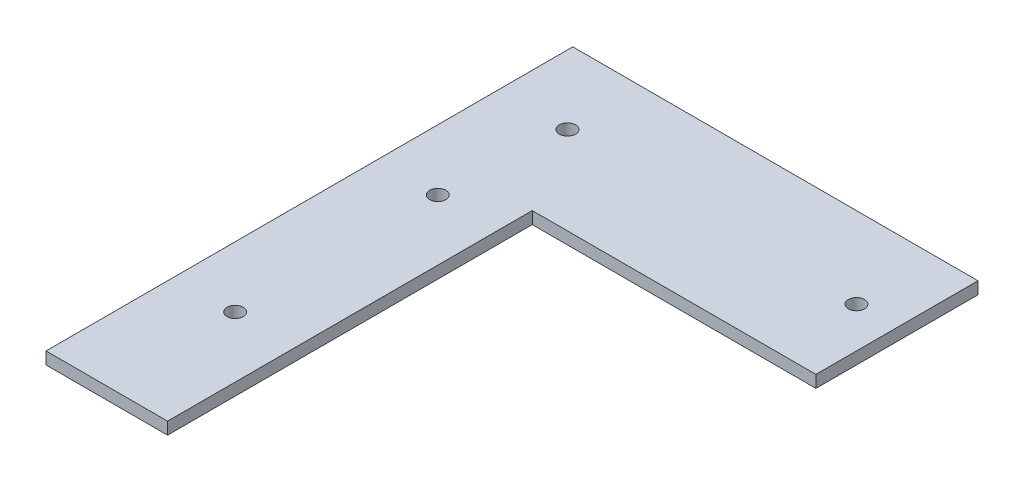
ISO-10303-21;
HEADER;
FILE_DESCRIPTION(('STEP AP214'),'2;1');
FILE_NAME('part.step','',(''),(''),'','','');
FILE_SCHEMA(('AUTOMOTIVE_DESIGN { 1 0 10303 214 1 1 1 1 }'));
ENDSEC;
DATA;
#1=APPLICATION_CONTEXT('core data for automotive mechanical design processes');
#2=APPLICATION_PROTOCOL_DEFINITION('international standard','automotive_design',2000,#1);
#3=PRODUCT_CONTEXT('',#1,'mechanical');
#4=PRODUCT('Part','Part','',(#3));
#5=PRODUCT_RELATED_PRODUCT_CATEGORY('part','',(#4));
#6=PRODUCT_DEFINITION_FORMATION('','',#4);
#7=PRODUCT_DEFINITION_CONTEXT('part definition',#1,'design');
#8=PRODUCT_DEFINITION('design','',#6,#7);
#9=PRODUCT_DEFINITION_SHAPE('','',#8);
#10=(LENGTH_UNIT() NAMED_UNIT(*) SI_UNIT(.MILLI.,.METRE.));
#11=(NAMED_UNIT(*) PLANE_ANGLE_UNIT() SI_UNIT($,.RADIAN.));
#12=(NAMED_UNIT(*) SI_UNIT($,.STERADIAN.) SOLID_ANGLE_UNIT());
#13=UNCERTAINTY_MEASURE_WITH_UNIT(LENGTH_MEASURE(1.E-05),#10,'distance_accuracy_value','');
#14=(GEOMETRIC_REPRESENTATION_CONTEXT(3) GLOBAL_UNCERTAINTY_ASSIGNED_CONTEXT((#13)) GLOBAL_UNIT_ASSIGNED_CONTEXT((#10,
#11,#12)) REPRESENTATION_CONTEXT('',''));
#15=CARTESIAN_POINT('',(0.,0.,0.));
#16=DIRECTION('',(0.,0.,1.));
#17=DIRECTION('',(1.,0.,0.));
#18=AXIS2_PLACEMENT_3D('',#15,#16,#17);
#19=CARTESIAN_POINT('',(-22.4355300859599,3.,-53.323782234957));
#20=DIRECTION('',(-1.,0.,0.));
#21=DIRECTION('',(0.,0.,1.));
#22=AXIS2_PLACEMENT_3D('',#19,#20,#21);
#23=PLANE('',#22);
#24=DIRECTION('',(0.,0.,-1.));
#25=VECTOR('',#24,1.);
#26=CARTESIAN_POINT('',(-22.4355300859599,0.,-53.323782234957));
#27=LINE('',#26,#25);
#28=CARTESIAN_POINT('',(-22.4355300859599,0.,36.676217765043));
#29=VERTEX_POINT('',#28);
#30=CARTESIAN_POINT('',(-22.4355300859599,0.,-53.323782234957));
#31=VERTEX_POINT('',#30);
#32=EDGE_CURVE('E117',#29,#31,#27,.T.);
#33=ORIENTED_EDGE('',*,*,#32,.T.);
#34=DIRECTION('',(0.,-1.,0.));
#35=VECTOR('',#34,1.);
#36=CARTESIAN_POINT('',(-22.4355300859599,3.,-53.323782234957));
#37=LINE('',#36,#35);
#38=CARTESIAN_POINT('',(-22.4355300859599,3.,-53.323782234957));
#39=VERTEX_POINT('',#38);
#40=EDGE_CURVE('E11',#39,#31,#37,.T.);
#41=ORIENTED_EDGE('',*,*,#40,.F.);
#42=DIRECTION('',(0.,0.,-1.));
#43=VECTOR('',#42,1.);
#44=CARTESIAN_POINT('',(-22.4355300859599,3.,-53.323782234957));
#45=LINE('',#44,#43);
#46=CARTESIAN_POINT('',(-22.4355300859599,3.,36.676217765043));
#47=VERTEX_POINT('',#46);
#48=EDGE_CURVE('E128',#47,#39,#45,.T.);
#49=ORIENTED_EDGE('',*,*,#48,.F.);
#50=DIRECTION('',(0.,-1.,0.));
#51=VECTOR('',#50,1.);
#52=CARTESIAN_POINT('',(-22.4355300859599,3.,36.676217765043));
#53=LINE('',#52,#51);
#54=EDGE_CURVE('E113',#47,#29,#53,.T.);
#55=ORIENTED_EDGE('',*,*,#54,.T.);
#56=EDGE_LOOP('',(#33,#41,#49,#55));
#57=FACE_BOUND('',#56,.T.);
#58=ADVANCED_FACE('F33',(#57),#23,.F.);
#59=CARTESIAN_POINT('',(47.5644699140401,3.,-53.323782234957));
#60=DIRECTION('',(0.,0.,-1.));
#61=DIRECTION('',(-1.,0.,0.));
#62=AXIS2_PLACEMENT_3D('',#59,#60,#61);
#63=PLANE('',#62);
#64=DIRECTION('',(1.,0.,0.));
#65=VECTOR('',#64,1.);
#66=CARTESIAN_POINT('',(47.5644699140401,0.,-53.323782234957));
#67=LINE('',#66,#65);
#68=CARTESIAN_POINT('',(47.5644699140401,0.,-53.323782234957));
#69=VERTEX_POINT('',#68);
#70=EDGE_CURVE('E120',#31,#69,#67,.T.);
#71=ORIENTED_EDGE('',*,*,#70,.T.);
#72=DIRECTION('',(0.,-1.,0.));
#73=VECTOR('',#72,1.);
#74=CARTESIAN_POINT('',(47.5644699140401,3.,-53.323782234957));
#75=LINE('',#74,#73);
#76=CARTESIAN_POINT('',(47.5644699140401,3.,-53.323782234957));
#77=VERTEX_POINT('',#76);
#78=EDGE_CURVE('E41',#77,#69,#75,.T.);
#79=ORIENTED_EDGE('',*,*,#78,.F.);
#80=DIRECTION('',(1.,0.,0.));
#81=VECTOR('',#80,1.);
#82=CARTESIAN_POINT('',(47.5644699140401,3.,-53.323782234957));
#83=LINE('',#82,#81);
#84=EDGE_CURVE('E86',#39,#77,#83,.T.);
#85=ORIENTED_EDGE('',*,*,#84,.F.);
#86=ORIENTED_EDGE('',*,*,#40,.T.);
#87=EDGE_LOOP('',(#71,#79,#85,#86));
#88=FACE_BOUND('',#87,.T.);
#89=ADVANCED_FACE('F153',(#88),#63,.F.);
#90=CARTESIAN_POINT('',(47.5644699140401,3.,-93.323782234957));
#91=DIRECTION('',(-1.,0.,0.));
#92=DIRECTION('',(0.,0.,1.));
#93=AXIS2_PLACEMENT_3D('',#90,#91,#92);
#94=PLANE('',#93);
#95=DIRECTION('',(0.,0.,-1.));
#96=VECTOR('',#95,1.);
#97=CARTESIAN_POINT('',(47.5644699140401,0.,-93.323782234957));
#98=LINE('',#97,#96);
#99=CARTESIAN_POINT('',(47.5644699140401,0.,-93.323782234957));
#100=VERTEX_POINT('',#99);
#101=EDGE_CURVE('E123',#69,#100,#98,.T.);
#102=ORIENTED_EDGE('',*,*,#101,.T.);
#103=DIRECTION('',(0.,-1.,0.));
#104=VECTOR('',#103,1.);
#105=CARTESIAN_POINT('',(47.5644699140401,3.,-93.323782234957));
#106=LINE('',#105,#104);
#107=CARTESIAN_POINT('',(47.5644699140401,3.,-93.323782234957));
#108=VERTEX_POINT('',#107);
#109=EDGE_CURVE('E108',#108,#100,#106,.T.);
#110=ORIENTED_EDGE('',*,*,#109,.F.);
#111=DIRECTION('',(0.,0.,-1.));
#112=VECTOR('',#111,1.);
#113=CARTESIAN_POINT('',(47.5644699140401,3.,-93.323782234957));
#114=LINE('',#113,#112);
#115=EDGE_CURVE('E99',#77,#108,#114,.T.);
#116=ORIENTED_EDGE('',*,*,#115,.F.);
#117=ORIENTED_EDGE('',*,*,#78,.T.);
#118=EDGE_LOOP('',(#102,#110,#116,#117));
#119=FACE_BOUND('',#118,.T.);
#120=ADVANCED_FACE('F134',(#119),#94,.F.);
#121=CARTESIAN_POINT('',(-52.4355300859599,3.,-93.323782234957));
#122=DIRECTION('',(0.,0.,1.));
#123=DIRECTION('',(1.,0.,0.));
#124=AXIS2_PLACEMENT_3D('',#121,#122,#123);
#125=PLANE('',#124);
#126=DIRECTION('',(-1.,0.,0.));
#127=VECTOR('',#126,1.);
#128=CARTESIAN_POINT('',(-52.4355300859599,0.,-93.323782234957));
#129=LINE('',#128,#127);
#130=CARTESIAN_POINT('',(-52.4355300859599,0.,-93.323782234957));
#131=VERTEX_POINT('',#130);
#132=EDGE_CURVE('E107',#100,#131,#129,.T.);
#133=ORIENTED_EDGE('',*,*,#132,.T.);
#134=DIRECTION('',(0.,-1.,0.));
#135=VECTOR('',#134,1.);
#136=CARTESIAN_POINT('',(-52.4355300859599,3.,-93.323782234957));
#137=LINE('',#136,#135);
#138=CARTESIAN_POINT('',(-52.4355300859599,3.,-93.323782234957));
#139=VERTEX_POINT('',#138);
#140=EDGE_CURVE('E104',#139,#131,#137,.T.);
#141=ORIENTED_EDGE('',*,*,#140,.F.);
#142=DIRECTION('',(-1.,0.,0.));
#143=VECTOR('',#142,1.);
#144=CARTESIAN_POINT('',(-52.4355300859599,3.,-93.323782234957));
#145=LINE('',#144,#143);
#146=EDGE_CURVE('E93',#108,#139,#145,.T.);
#147=ORIENTED_EDGE('',*,*,#146,.F.);
#148=ORIENTED_EDGE('',*,*,#109,.T.);
#149=EDGE_LOOP('',(#133,#141,#147,#148));
#150=FACE_BOUND('',#149,.T.);
#151=ADVANCED_FACE('F105',(#150),#125,.F.);
#152=CARTESIAN_POINT('',(-52.4355300859599,3.,36.676217765043));
#153=DIRECTION('',(1.,0.,0.));
#154=DIRECTION('',(0.,0.,-1.));
#155=AXIS2_PLACEMENT_3D('',#152,#153,#154);
#156=PLANE('',#155);
#157=DIRECTION('',(0.,0.,1.));
#158=VECTOR('',#157,1.);
#159=CARTESIAN_POINT('',(-52.4355300859599,0.,36.676217765043));
#160=LINE('',#159,#158);
#161=CARTESIAN_POINT('',(-52.4355300859599,0.,36.676217765043));
#162=VERTEX_POINT('',#161);
#163=EDGE_CURVE('E72',#131,#162,#160,.T.);
#164=ORIENTED_EDGE('',*,*,#163,.T.);
#165=DIRECTION('',(0.,-1.,0.));
#166=VECTOR('',#165,1.);
#167=CARTESIAN_POINT('',(-52.4355300859599,3.,36.676217765043));
#168=LINE('',#167,#166);
#169=CARTESIAN_POINT('',(-52.4355300859599,3.,36.676217765043));
#170=VERTEX_POINT('',#169);
#171=EDGE_CURVE('E109',#170,#162,#168,.T.);
#172=ORIENTED_EDGE('',*,*,#171,.F.);
#173=DIRECTION('',(0.,0.,1.));
#174=VECTOR('',#173,1.);
#175=CARTESIAN_POINT('',(-52.4355300859599,3.,36.676217765043));
#176=LINE('',#175,#174);
#177=EDGE_CURVE('E97',#139,#170,#176,.T.);
#178=ORIENTED_EDGE('',*,*,#177,.F.);
#179=ORIENTED_EDGE('',*,*,#140,.T.);
#180=EDGE_LOOP('',(#164,#172,#178,#179));
#181=FACE_BOUND('',#180,.T.);
#182=ADVANCED_FACE('F111',(#181),#156,.F.);
#183=CARTESIAN_POINT('',(-22.4355300859599,3.,36.676217765043));
#184=DIRECTION('',(0.,0.,-1.));
#185=DIRECTION('',(-1.,0.,0.));
#186=AXIS2_PLACEMENT_3D('',#183,#184,#185);
#187=PLANE('',#186);
#188=DIRECTION('',(1.,0.,0.));
#189=VECTOR('',#188,1.);
#190=CARTESIAN_POINT('',(-22.4355300859599,0.,36.676217765043));
#191=LINE('',#190,#189);
#192=EDGE_CURVE('E78',#162,#29,#191,.T.);
#193=ORIENTED_EDGE('',*,*,#192,.T.);
#194=ORIENTED_EDGE('',*,*,#54,.F.);
#195=DIRECTION('',(1.,0.,0.));
#196=VECTOR('',#195,1.);
#197=CARTESIAN_POINT('',(-22.4355300859599,3.,36.676217765043));
#198=LINE('',#197,#196);
#199=EDGE_CURVE('E49',#170,#47,#198,.T.);
#200=ORIENTED_EDGE('',*,*,#199,.F.);
#201=ORIENTED_EDGE('',*,*,#171,.T.);
#202=EDGE_LOOP('',(#193,#194,#200,#201));
#203=FACE_BOUND('',#202,.T.);
#204=ADVANCED_FACE('F141',(#203),#187,.F.);
#205=CARTESIAN_POINT('',(0.,3.,0.));
#206=DIRECTION('',(0.,-1.,0.));
#207=DIRECTION('',(0.,0.,-1.));
#208=AXIS2_PLACEMENT_3D('',#205,#206,#207);
#209=PLANE('',#208);
#210=CARTESIAN_POINT('',(-37.4355300859599,3.,4.99732646923232));
#211=DIRECTION('',(0.,1.,0.));
#212=DIRECTION('',(0.,0.,1.));
#213=AXIS2_PLACEMENT_3D('',#210,#211,#212);
#214=CIRCLE('',#213,2.00000000000001);
#215=CARTESIAN_POINT('',(-37.4355300859599,3.,6.99732646923233));
#216=VERTEX_POINT('',#215);
#217=EDGE_CURVE('E239',#216,#216,#214,.T.);
#218=ORIENTED_EDGE('',*,*,#217,.F.);
#219=EDGE_LOOP('',(#218));
#220=FACE_BOUND('',#219,.T.);
#221=CARTESIAN_POINT('',(-37.4355300859599,3.,-45.0026735307677));
#222=DIRECTION('',(0.,1.,0.));
#223=DIRECTION('',(0.,0.,1.));
#224=AXIS2_PLACEMENT_3D('',#221,#222,#223);
#225=CIRCLE('',#224,2.);
#226=CARTESIAN_POINT('',(-37.4355300859599,3.,-43.0026735307677));
#227=VERTEX_POINT('',#226);
#228=EDGE_CURVE('E241',#227,#227,#225,.T.);
#229=ORIENTED_EDGE('',*,*,#228,.F.);
#230=EDGE_LOOP('',(#229));
#231=FACE_BOUND('',#230,.T.);
#232=CARTESIAN_POINT('',(37.5644699140401,3.,-73.323782234957));
#233=DIRECTION('',(0.,1.,0.));
#234=DIRECTION('',(0.,0.,1.));
#235=AXIS2_PLACEMENT_3D('',#232,#233,#234);
#236=CIRCLE('',#235,2.);
#237=CARTESIAN_POINT('',(37.5644699140401,3.,-71.323782234957));
#238=VERTEX_POINT('',#237);
#239=EDGE_CURVE('E255',#238,#238,#236,.T.);
#240=ORIENTED_EDGE('',*,*,#239,.F.);
#241=EDGE_LOOP('',(#240));
#242=FACE_BOUND('',#241,.T.);
#243=CARTESIAN_POINT('',(-35.4355300859599,3.,-75.0026735307677));
#244=DIRECTION('',(0.,1.,0.));
#245=DIRECTION('',(0.,0.,1.));
#246=AXIS2_PLACEMENT_3D('',#243,#244,#245);
#247=CIRCLE('',#246,2.);
#248=CARTESIAN_POINT('',(-35.4355300859599,3.,-73.0026735307677));
#249=VERTEX_POINT('',#248);
#250=EDGE_CURVE('E247',#249,#249,#247,.T.);
#251=ORIENTED_EDGE('',*,*,#250,.F.);
#252=EDGE_LOOP('',(#251));
#253=FACE_BOUND('',#252,.T.);
#254=ORIENTED_EDGE('',*,*,#48,.T.);
#255=ORIENTED_EDGE('',*,*,#84,.T.);
#256=ORIENTED_EDGE('',*,*,#115,.T.);
#257=ORIENTED_EDGE('',*,*,#146,.T.);
#258=ORIENTED_EDGE('',*,*,#177,.T.);
#259=ORIENTED_EDGE('',*,*,#199,.T.);
#260=EDGE_LOOP('',(#254,#255,#256,#257,#258,#259));
#261=FACE_BOUND('',#260,.T.);
#262=ADVANCED_FACE('F95',(#220,#231,#242,#253,#261),#209,.F.);
#263=CARTESIAN_POINT('',(0.,0.,0.));
#264=DIRECTION('',(0.,-1.,0.));
#265=DIRECTION('',(0.,0.,-1.));
#266=AXIS2_PLACEMENT_3D('',#263,#264,#265);
#267=PLANE('',#266);
#268=CARTESIAN_POINT('',(-37.4355300859599,0.,4.99732646923232));
#269=DIRECTION('',(0.,1.,0.));
#270=DIRECTION('',(0.,0.,1.));
#271=AXIS2_PLACEMENT_3D('',#268,#269,#270);
#272=CIRCLE('',#271,2.00000000000001);
#273=CARTESIAN_POINT('',(-37.4355300859599,0.,6.99732646923233));
#274=VERTEX_POINT('',#273);
#275=EDGE_CURVE('E236',#274,#274,#272,.T.);
#276=ORIENTED_EDGE('',*,*,#275,.T.);
#277=EDGE_LOOP('',(#276));
#278=FACE_BOUND('',#277,.T.);
#279=CARTESIAN_POINT('',(-37.4355300859599,0.,-45.0026735307677));
#280=DIRECTION('',(0.,1.,0.));
#281=DIRECTION('',(0.,0.,1.));
#282=AXIS2_PLACEMENT_3D('',#279,#280,#281);
#283=CIRCLE('',#282,2.);
#284=CARTESIAN_POINT('',(-37.4355300859599,0.,-43.0026735307677));
#285=VERTEX_POINT('',#284);
#286=EDGE_CURVE('E260',#285,#285,#283,.T.);
#287=ORIENTED_EDGE('',*,*,#286,.T.);
#288=EDGE_LOOP('',(#287));
#289=FACE_BOUND('',#288,.T.);
#290=CARTESIAN_POINT('',(37.5644699140401,0.,-73.323782234957));
#291=DIRECTION('',(0.,1.,0.));
#292=DIRECTION('',(0.,0.,1.));
#293=AXIS2_PLACEMENT_3D('',#290,#291,#292);
#294=CIRCLE('',#293,2.);
#295=CARTESIAN_POINT('',(37.5644699140401,0.,-71.323782234957));
#296=VERTEX_POINT('',#295);
#297=EDGE_CURVE('E250',#296,#296,#294,.T.);
#298=ORIENTED_EDGE('',*,*,#297,.T.);
#299=EDGE_LOOP('',(#298));
#300=FACE_BOUND('',#299,.T.);
#301=CARTESIAN_POINT('',(-35.4355300859599,0.,-75.0026735307677));
#302=DIRECTION('',(0.,1.,0.));
#303=DIRECTION('',(0.,0.,1.));
#304=AXIS2_PLACEMENT_3D('',#301,#302,#303);
#305=CIRCLE('',#304,2.);
#306=CARTESIAN_POINT('',(-35.4355300859599,0.,-73.0026735307677));
#307=VERTEX_POINT('',#306);
#308=EDGE_CURVE('E121',#307,#307,#305,.T.);
#309=ORIENTED_EDGE('',*,*,#308,.T.);
#310=EDGE_LOOP('',(#309));
#311=FACE_BOUND('',#310,.T.);
#312=ORIENTED_EDGE('',*,*,#32,.F.);
#313=ORIENTED_EDGE('',*,*,#192,.F.);
#314=ORIENTED_EDGE('',*,*,#163,.F.);
#315=ORIENTED_EDGE('',*,*,#132,.F.);
#316=ORIENTED_EDGE('',*,*,#101,.F.);
#317=ORIENTED_EDGE('',*,*,#70,.F.);
#318=EDGE_LOOP('',(#312,#313,#314,#315,#316,#317));
#319=FACE_BOUND('',#318,.T.);
#320=ADVANCED_FACE('F137',(#278,#289,#300,#311,#319),#267,.T.);
#321=CARTESIAN_POINT('',(-35.4355300859599,0.,-75.0026735307677));
#322=DIRECTION('',(0.,1.,0.));
#323=DIRECTION('',(0.,0.,1.));
#324=AXIS2_PLACEMENT_3D('',#321,#322,#323);
#325=CYLINDRICAL_SURFACE('',#324,2.);
#326=ORIENTED_EDGE('',*,*,#308,.F.);
#327=EDGE_LOOP('',(#326));
#328=FACE_BOUND('',#327,.T.);
#329=ORIENTED_EDGE('',*,*,#250,.T.);
#330=EDGE_LOOP('',(#329));
#331=FACE_BOUND('',#330,.T.);
#332=ADVANCED_FACE('F190',(#328,#331),#325,.F.);
#333=CARTESIAN_POINT('',(37.5644699140401,0.,-73.323782234957));
#334=DIRECTION('',(0.,1.,0.));
#335=DIRECTION('',(0.,0.,1.));
#336=AXIS2_PLACEMENT_3D('',#333,#334,#335);
#337=CYLINDRICAL_SURFACE('',#336,2.);
#338=ORIENTED_EDGE('',*,*,#297,.F.);
#339=EDGE_LOOP('',(#338));
#340=FACE_BOUND('',#339,.T.);
#341=ORIENTED_EDGE('',*,*,#239,.T.);
#342=EDGE_LOOP('',(#341));
#343=FACE_BOUND('',#342,.T.);
#344=ADVANCED_FACE('F199',(#340,#343),#337,.F.);
#345=CARTESIAN_POINT('',(-37.4355300859599,0.,-45.0026735307677));
#346=DIRECTION('',(0.,1.,0.));
#347=DIRECTION('',(0.,0.,1.));
#348=AXIS2_PLACEMENT_3D('',#345,#346,#347);
#349=CYLINDRICAL_SURFACE('',#348,2.);
#350=ORIENTED_EDGE('',*,*,#286,.F.);
#351=EDGE_LOOP('',(#350));
#352=FACE_BOUND('',#351,.T.);
#353=ORIENTED_EDGE('',*,*,#228,.T.);
#354=EDGE_LOOP('',(#353));
#355=FACE_BOUND('',#354,.T.);
#356=ADVANCED_FACE('F209',(#352,#355),#349,.F.);
#357=CARTESIAN_POINT('',(-37.4355300859599,0.,4.99732646923232));
#358=DIRECTION('',(0.,1.,0.));
#359=DIRECTION('',(0.,0.,1.));
#360=AXIS2_PLACEMENT_3D('',#357,#358,#359);
#361=CYLINDRICAL_SURFACE('',#360,2.00000000000001);
#362=ORIENTED_EDGE('',*,*,#275,.F.);
#363=EDGE_LOOP('',(#362));
#364=FACE_BOUND('',#363,.T.);
#365=ORIENTED_EDGE('',*,*,#217,.T.);
#366=EDGE_LOOP('',(#365));
#367=FACE_BOUND('',#366,.T.);
#368=ADVANCED_FACE('F219',(#364,#367),#361,.F.);
#369=CLOSED_SHELL('',(#58,#89,#120,#151,#182,#204,#262,#320,#332,#344,#356,#368));
#370=MANIFOLD_SOLID_BREP('B2',#369);
#371=ADVANCED_BREP_SHAPE_REPRESENTATION('',(#18,#370),#14);
#372=SHAPE_DEFINITION_REPRESENTATION(#9,#371);
ENDSEC;
END-ISO-10303-21;
